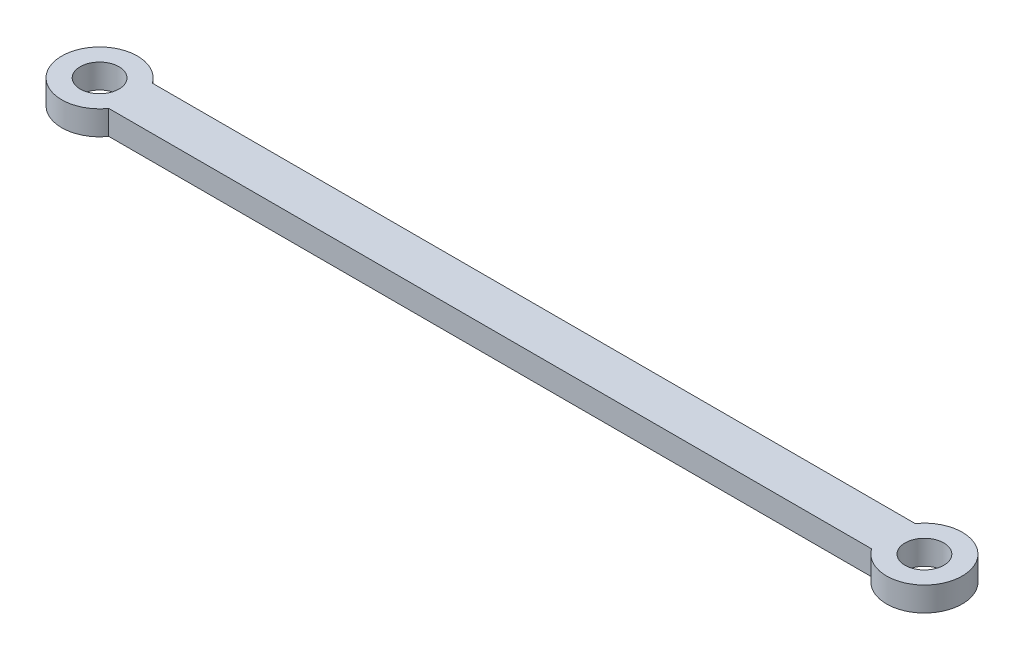
ISO-10303-21;
HEADER;
FILE_DESCRIPTION(('STEP AP214'),'2;1');
FILE_NAME('part.step','',(''),(''),'','','');
FILE_SCHEMA(('AUTOMOTIVE_DESIGN { 1 0 10303 214 1 1 1 1 }'));
ENDSEC;
DATA;
#1=APPLICATION_CONTEXT('core data for automotive mechanical design processes');
#2=APPLICATION_PROTOCOL_DEFINITION('international standard','automotive_design',2000,#1);
#3=PRODUCT_CONTEXT('',#1,'mechanical');
#4=PRODUCT('Part','Part','',(#3));
#5=PRODUCT_RELATED_PRODUCT_CATEGORY('part','',(#4));
#6=PRODUCT_DEFINITION_FORMATION('','',#4);
#7=PRODUCT_DEFINITION_CONTEXT('part definition',#1,'design');
#8=PRODUCT_DEFINITION('design','',#6,#7);
#9=PRODUCT_DEFINITION_SHAPE('','',#8);
#10=(LENGTH_UNIT() NAMED_UNIT(*) SI_UNIT(.MILLI.,.METRE.));
#11=(NAMED_UNIT(*) PLANE_ANGLE_UNIT() SI_UNIT($,.RADIAN.));
#12=(NAMED_UNIT(*) SI_UNIT($,.STERADIAN.) SOLID_ANGLE_UNIT());
#13=UNCERTAINTY_MEASURE_WITH_UNIT(LENGTH_MEASURE(1.E-05),#10,'distance_accuracy_value','');
#14=(GEOMETRIC_REPRESENTATION_CONTEXT(3) GLOBAL_UNCERTAINTY_ASSIGNED_CONTEXT((#13)) GLOBAL_UNIT_ASSIGNED_CONTEXT((#10,
#11,#12)) REPRESENTATION_CONTEXT('',''));
#15=CARTESIAN_POINT('',(0.,0.,0.));
#16=DIRECTION('',(0.,0.,1.));
#17=DIRECTION('',(1.,0.,0.));
#18=AXIS2_PLACEMENT_3D('',#15,#16,#17);
#19=CARTESIAN_POINT('',(85.,5.,0.));
#20=DIRECTION('',(0.,1.,0.));
#21=DIRECTION('',(0.,0.,1.));
#22=AXIS2_PLACEMENT_3D('',#19,#20,#21);
#23=PLANE('',#22);
#24=CARTESIAN_POINT('',(85.,5.,0.));
#25=DIRECTION('',(0.,1.,0.));
#26=DIRECTION('',(0.,0.,1.));
#27=AXIS2_PLACEMENT_3D('',#24,#25,#26);
#28=CIRCLE('',#27,4.00000000000001);
#29=CARTESIAN_POINT('',(85.,5.,4.00000000000001));
#30=VERTEX_POINT('',#29);
#31=EDGE_CURVE('E101',#30,#30,#28,.T.);
#32=ORIENTED_EDGE('',*,*,#31,.F.);
#33=EDGE_LOOP('',(#32));
#34=FACE_BOUND('',#33,.T.);
#35=CARTESIAN_POINT('',(85.,5.,0.));
#36=DIRECTION('',(0.,1.,0.));
#37=DIRECTION('',(0.,0.,1.));
#38=AXIS2_PLACEMENT_3D('',#35,#36,#37);
#39=CIRCLE('',#38,7.81024967590666);
#40=CARTESIAN_POINT('',(78.6164273325981,5.,4.5));
#41=VERTEX_POINT('',#40);
#42=CARTESIAN_POINT('',(78.6164273325981,5.,-4.5));
#43=VERTEX_POINT('',#42);
#44=EDGE_CURVE('E86',#41,#43,#39,.T.);
#45=ORIENTED_EDGE('',*,*,#44,.T.);
#46=DIRECTION('',(-1.,0.,0.));
#47=VECTOR('',#46,1.);
#48=CARTESIAN_POINT('',(-78.6164273325981,5.,-4.5));
#49=LINE('',#48,#47);
#50=CARTESIAN_POINT('',(-78.6164273325981,5.,-4.5));
#51=VERTEX_POINT('',#50);
#52=EDGE_CURVE('E81',#43,#51,#49,.T.);
#53=ORIENTED_EDGE('',*,*,#52,.T.);
#54=CARTESIAN_POINT('',(-85.,5.,0.));
#55=DIRECTION('',(0.,1.,0.));
#56=DIRECTION('',(0.,0.,-1.));
#57=AXIS2_PLACEMENT_3D('',#54,#55,#56);
#58=CIRCLE('',#57,7.81024967590666);
#59=CARTESIAN_POINT('',(-78.6164273325981,5.,4.5));
#60=VERTEX_POINT('',#59);
#61=EDGE_CURVE('E84',#51,#60,#58,.T.);
#62=ORIENTED_EDGE('',*,*,#61,.T.);
#63=DIRECTION('',(1.,0.,0.));
#64=VECTOR('',#63,1.);
#65=CARTESIAN_POINT('',(-78.6164273325981,5.,4.5));
#66=LINE('',#65,#64);
#67=EDGE_CURVE('E51',#60,#41,#66,.T.);
#68=ORIENTED_EDGE('',*,*,#67,.T.);
#69=EDGE_LOOP('',(#45,#53,#62,#68));
#70=FACE_BOUND('',#69,.T.);
#71=CARTESIAN_POINT('',(-85.,5.,0.));
#72=DIRECTION('',(0.,1.,0.));
#73=DIRECTION('',(0.,0.,-1.));
#74=AXIS2_PLACEMENT_3D('',#71,#72,#73);
#75=CIRCLE('',#74,4.00000000000001);
#76=CARTESIAN_POINT('',(-85.,5.,-4.00000000000001));
#77=VERTEX_POINT('',#76);
#78=EDGE_CURVE('E116',#77,#77,#75,.T.);
#79=ORIENTED_EDGE('',*,*,#78,.F.);
#80=EDGE_LOOP('',(#79));
#81=FACE_BOUND('',#80,.T.);
#82=ADVANCED_FACE('F34',(#34,#70,#81),#23,.T.);
#83=CARTESIAN_POINT('',(85.,0.,0.));
#84=DIRECTION('',(0.,1.,0.));
#85=DIRECTION('',(0.,0.,1.));
#86=AXIS2_PLACEMENT_3D('',#83,#84,#85);
#87=PLANE('',#86);
#88=CARTESIAN_POINT('',(85.,0.,0.));
#89=DIRECTION('',(0.,1.,0.));
#90=DIRECTION('',(0.,0.,1.));
#91=AXIS2_PLACEMENT_3D('',#88,#89,#90);
#92=CIRCLE('',#91,7.81024967590666);
#93=CARTESIAN_POINT('',(78.6164273325981,0.,4.5));
#94=VERTEX_POINT('',#93);
#95=CARTESIAN_POINT('',(78.6164273325981,0.,-4.5));
#96=VERTEX_POINT('',#95);
#97=EDGE_CURVE('E98',#94,#96,#92,.T.);
#98=ORIENTED_EDGE('',*,*,#97,.F.);
#99=DIRECTION('',(1.,0.,0.));
#100=VECTOR('',#99,1.);
#101=CARTESIAN_POINT('',(-78.6164273325981,0.,4.5));
#102=LINE('',#101,#100);
#103=CARTESIAN_POINT('',(-78.6164273325981,0.,4.5));
#104=VERTEX_POINT('',#103);
#105=EDGE_CURVE('E74',#104,#94,#102,.T.);
#106=ORIENTED_EDGE('',*,*,#105,.F.);
#107=CARTESIAN_POINT('',(-85.,0.,0.));
#108=DIRECTION('',(0.,1.,0.));
#109=DIRECTION('',(0.,0.,-1.));
#110=AXIS2_PLACEMENT_3D('',#107,#108,#109);
#111=CIRCLE('',#110,7.81024967590666);
#112=CARTESIAN_POINT('',(-78.6164273325981,0.,-4.5));
#113=VERTEX_POINT('',#112);
#114=EDGE_CURVE('E68',#113,#104,#111,.T.);
#115=ORIENTED_EDGE('',*,*,#114,.F.);
#116=DIRECTION('',(-1.,0.,0.));
#117=VECTOR('',#116,1.);
#118=CARTESIAN_POINT('',(-78.6164273325981,0.,-4.5));
#119=LINE('',#118,#117);
#120=EDGE_CURVE('E90',#96,#113,#119,.T.);
#121=ORIENTED_EDGE('',*,*,#120,.F.);
#122=EDGE_LOOP('',(#98,#106,#115,#121));
#123=FACE_BOUND('',#122,.T.);
#124=CARTESIAN_POINT('',(85.,0.,0.));
#125=DIRECTION('',(0.,1.,0.));
#126=DIRECTION('',(0.,0.,1.));
#127=AXIS2_PLACEMENT_3D('',#124,#125,#126);
#128=CIRCLE('',#127,4.00000000000001);
#129=CARTESIAN_POINT('',(85.,0.,4.00000000000001));
#130=VERTEX_POINT('',#129);
#131=EDGE_CURVE('E113',#130,#130,#128,.T.);
#132=ORIENTED_EDGE('',*,*,#131,.T.);
#133=EDGE_LOOP('',(#132));
#134=FACE_BOUND('',#133,.T.);
#135=CARTESIAN_POINT('',(-85.,0.,0.));
#136=DIRECTION('',(0.,1.,0.));
#137=DIRECTION('',(0.,0.,-1.));
#138=AXIS2_PLACEMENT_3D('',#135,#136,#137);
#139=CIRCLE('',#138,4.00000000000001);
#140=CARTESIAN_POINT('',(-85.,0.,-4.00000000000001));
#141=VERTEX_POINT('',#140);
#142=EDGE_CURVE('E119',#141,#141,#139,.T.);
#143=ORIENTED_EDGE('',*,*,#142,.T.);
#144=EDGE_LOOP('',(#143));
#145=FACE_BOUND('',#144,.T.);
#146=ADVANCED_FACE('F109',(#123,#134,#145),#87,.F.);
#147=CARTESIAN_POINT('',(85.,5.,0.));
#148=DIRECTION('',(0.,-1.,0.));
#149=DIRECTION('',(0.,0.,-1.));
#150=AXIS2_PLACEMENT_3D('',#147,#148,#149);
#151=CYLINDRICAL_SURFACE('',#150,7.81024967590666);
#152=ORIENTED_EDGE('',*,*,#97,.T.);
#153=DIRECTION('',(0.,-1.,0.));
#154=VECTOR('',#153,1.);
#155=CARTESIAN_POINT('',(78.6164273325981,5.,-4.5));
#156=LINE('',#155,#154);
#157=EDGE_CURVE('E11',#43,#96,#156,.T.);
#158=ORIENTED_EDGE('',*,*,#157,.F.);
#159=ORIENTED_EDGE('',*,*,#44,.F.);
#160=DIRECTION('',(0.,-1.,0.));
#161=VECTOR('',#160,1.);
#162=CARTESIAN_POINT('',(78.6164273325981,5.,4.5));
#163=LINE('',#162,#161);
#164=EDGE_CURVE('E94',#41,#94,#163,.T.);
#165=ORIENTED_EDGE('',*,*,#164,.T.);
#166=EDGE_LOOP('',(#152,#158,#159,#165));
#167=FACE_BOUND('',#166,.T.);
#168=ADVANCED_FACE('F36',(#167),#151,.T.);
#169=CARTESIAN_POINT('',(-78.6164273325981,5.,-4.5));
#170=DIRECTION('',(0.,0.,1.));
#171=DIRECTION('',(1.,0.,0.));
#172=AXIS2_PLACEMENT_3D('',#169,#170,#171);
#173=PLANE('',#172);
#174=ORIENTED_EDGE('',*,*,#120,.T.);
#175=DIRECTION('',(0.,-1.,0.));
#176=VECTOR('',#175,1.);
#177=CARTESIAN_POINT('',(-78.6164273325981,5.,-4.5));
#178=LINE('',#177,#176);
#179=EDGE_CURVE('E43',#51,#113,#178,.T.);
#180=ORIENTED_EDGE('',*,*,#179,.F.);
#181=ORIENTED_EDGE('',*,*,#52,.F.);
#182=ORIENTED_EDGE('',*,*,#157,.T.);
#183=EDGE_LOOP('',(#174,#180,#181,#182));
#184=FACE_BOUND('',#183,.T.);
#185=ADVANCED_FACE('F89',(#184),#173,.F.);
#186=CARTESIAN_POINT('',(-85.,5.,0.));
#187=DIRECTION('',(0.,-1.,0.));
#188=DIRECTION('',(0.,0.,-1.));
#189=AXIS2_PLACEMENT_3D('',#186,#187,#188);
#190=CYLINDRICAL_SURFACE('',#189,7.81024967590666);
#191=ORIENTED_EDGE('',*,*,#114,.T.);
#192=DIRECTION('',(0.,-1.,0.));
#193=VECTOR('',#192,1.);
#194=CARTESIAN_POINT('',(-78.6164273325981,5.,4.5));
#195=LINE('',#194,#193);
#196=EDGE_CURVE('E91',#60,#104,#195,.T.);
#197=ORIENTED_EDGE('',*,*,#196,.F.);
#198=ORIENTED_EDGE('',*,*,#61,.F.);
#199=ORIENTED_EDGE('',*,*,#179,.T.);
#200=EDGE_LOOP('',(#191,#197,#198,#199));
#201=FACE_BOUND('',#200,.T.);
#202=ADVANCED_FACE('F92',(#201),#190,.T.);
#203=CARTESIAN_POINT('',(-78.6164273325981,5.,4.5));
#204=DIRECTION('',(0.,0.,-1.));
#205=DIRECTION('',(-1.,0.,0.));
#206=AXIS2_PLACEMENT_3D('',#203,#204,#205);
#207=PLANE('',#206);
#208=ORIENTED_EDGE('',*,*,#105,.T.);
#209=ORIENTED_EDGE('',*,*,#164,.F.);
#210=ORIENTED_EDGE('',*,*,#67,.F.);
#211=ORIENTED_EDGE('',*,*,#196,.T.);
#212=EDGE_LOOP('',(#208,#209,#210,#211));
#213=FACE_BOUND('',#212,.T.);
#214=ADVANCED_FACE('F106',(#213),#207,.F.);
#215=CARTESIAN_POINT('',(85.,5.,0.));
#216=DIRECTION('',(0.,-1.,0.));
#217=DIRECTION('',(0.,0.,-1.));
#218=AXIS2_PLACEMENT_3D('',#215,#216,#217);
#219=CYLINDRICAL_SURFACE('',#218,4.00000000000001);
#220=ORIENTED_EDGE('',*,*,#31,.T.);
#221=EDGE_LOOP('',(#220));
#222=FACE_BOUND('',#221,.T.);
#223=ORIENTED_EDGE('',*,*,#131,.F.);
#224=EDGE_LOOP('',(#223));
#225=FACE_BOUND('',#224,.T.);
#226=ADVANCED_FACE('F136',(#222,#225),#219,.F.);
#227=CARTESIAN_POINT('',(-85.,5.,0.));
#228=DIRECTION('',(0.,-1.,0.));
#229=DIRECTION('',(0.,0.,-1.));
#230=AXIS2_PLACEMENT_3D('',#227,#228,#229);
#231=CYLINDRICAL_SURFACE('',#230,4.00000000000001);
#232=ORIENTED_EDGE('',*,*,#78,.T.);
#233=EDGE_LOOP('',(#232));
#234=FACE_BOUND('',#233,.T.);
#235=ORIENTED_EDGE('',*,*,#142,.F.);
#236=EDGE_LOOP('',(#235));
#237=FACE_BOUND('',#236,.T.);
#238=ADVANCED_FACE('F125',(#234,#237),#231,.F.);
#239=CLOSED_SHELL('',(#82,#146,#168,#185,#202,#214,#226,#238));
#240=MANIFOLD_SOLID_BREP('B2',#239);
#241=ADVANCED_BREP_SHAPE_REPRESENTATION('',(#18,#240),#14);
#242=SHAPE_DEFINITION_REPRESENTATION(#9,#241);
ENDSEC;
END-ISO-10303-21;
